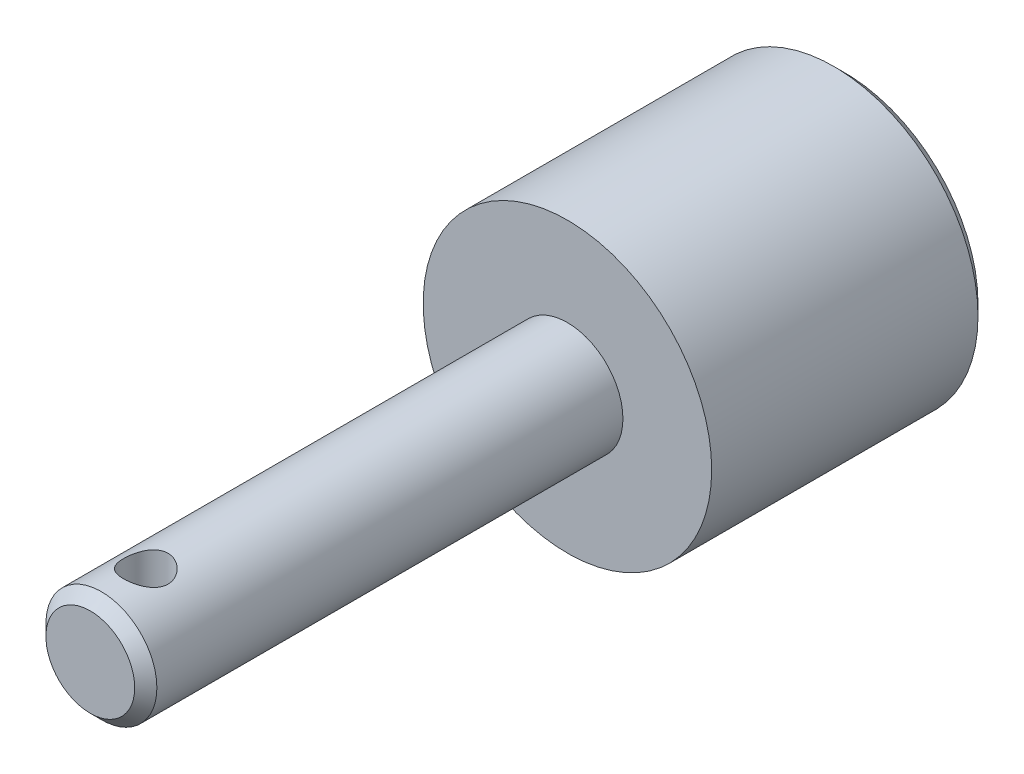
ISO-10303-21;
HEADER;
FILE_DESCRIPTION(('STEP AP214'),'2;1');
FILE_NAME('part.step','',(''),(''),'','','');
FILE_SCHEMA(('AUTOMOTIVE_DESIGN { 1 0 10303 214 1 1 1 1 }'));
ENDSEC;
DATA;
#1=APPLICATION_CONTEXT('core data for automotive mechanical design processes');
#2=APPLICATION_PROTOCOL_DEFINITION('international standard','automotive_design',2000,#1);
#3=PRODUCT_CONTEXT('',#1,'mechanical');
#4=PRODUCT('Part','Part','',(#3));
#5=PRODUCT_RELATED_PRODUCT_CATEGORY('part','',(#4));
#6=PRODUCT_DEFINITION_FORMATION('','',#4);
#7=PRODUCT_DEFINITION_CONTEXT('part definition',#1,'design');
#8=PRODUCT_DEFINITION('design','',#6,#7);
#9=PRODUCT_DEFINITION_SHAPE('','',#8);
#10=(LENGTH_UNIT() NAMED_UNIT(*) SI_UNIT(.MILLI.,.METRE.));
#11=(NAMED_UNIT(*) PLANE_ANGLE_UNIT() SI_UNIT($,.RADIAN.));
#12=(NAMED_UNIT(*) SI_UNIT($,.STERADIAN.) SOLID_ANGLE_UNIT());
#13=UNCERTAINTY_MEASURE_WITH_UNIT(LENGTH_MEASURE(1.E-05),#10,'distance_accuracy_value','');
#14=(GEOMETRIC_REPRESENTATION_CONTEXT(3) GLOBAL_UNCERTAINTY_ASSIGNED_CONTEXT((#13)) GLOBAL_UNIT_ASSIGNED_CONTEXT((#10,
#11,#12)) REPRESENTATION_CONTEXT('',''));
#15=CARTESIAN_POINT('',(0.,0.,0.));
#16=DIRECTION('',(0.,0.,1.));
#17=DIRECTION('',(1.,0.,0.));
#18=AXIS2_PLACEMENT_3D('',#15,#16,#17);
#19=CARTESIAN_POINT('',(0.,0.,50.));
#20=DIRECTION('',(0.,0.,1.));
#21=DIRECTION('',(1.,0.,0.));
#22=AXIS2_PLACEMENT_3D('',#19,#20,#21);
#23=PLANE('',#22);
#24=CARTESIAN_POINT('',(0.,0.,50.));
#25=DIRECTION('',(0.,0.,1.));
#26=DIRECTION('',(1.,0.,0.));
#27=AXIS2_PLACEMENT_3D('',#24,#25,#26);
#28=CIRCLE('',#27,26.);
#29=CARTESIAN_POINT('',(26.,0.,50.));
#30=VERTEX_POINT('',#29);
#31=EDGE_CURVE('E158',#30,#30,#28,.T.);
#32=ORIENTED_EDGE('',*,*,#31,.T.);
#33=EDGE_LOOP('',(#32));
#34=FACE_BOUND('',#33,.T.);
#35=CARTESIAN_POINT('',(0.,0.,50.));
#36=DIRECTION('',(0.,0.,1.));
#37=DIRECTION('',(1.,0.,0.));
#38=AXIS2_PLACEMENT_3D('',#35,#36,#37);
#39=CIRCLE('',#38,10.);
#40=CARTESIAN_POINT('',(10.,0.,50.));
#41=VERTEX_POINT('',#40);
#42=EDGE_CURVE('E73',#41,#41,#39,.T.);
#43=ORIENTED_EDGE('',*,*,#42,.F.);
#44=EDGE_LOOP('',(#43));
#45=FACE_BOUND('',#44,.T.);
#46=ADVANCED_FACE('F41',(#34,#45),#23,.T.);
#47=CARTESIAN_POINT('',(0.,0.,50.));
#48=DIRECTION('',(0.,0.,-1.));
#49=DIRECTION('',(-1.,0.,0.));
#50=AXIS2_PLACEMENT_3D('',#47,#48,#49);
#51=CYLINDRICAL_SURFACE('',#50,26.);
#52=CARTESIAN_POINT('',(0.,0.,1.99999999999998));
#53=DIRECTION('',(0.,0.,1.));
#54=DIRECTION('',(1.,0.,0.));
#55=AXIS2_PLACEMENT_3D('',#52,#53,#54);
#56=CIRCLE('',#55,26.);
#57=CARTESIAN_POINT('',(26.,0.,1.99999999999998));
#58=VERTEX_POINT('',#57);
#59=EDGE_CURVE('E49',#58,#58,#56,.T.);
#60=ORIENTED_EDGE('',*,*,#59,.T.);
#61=EDGE_LOOP('',(#60));
#62=FACE_BOUND('',#61,.T.);
#63=ORIENTED_EDGE('',*,*,#31,.F.);
#64=EDGE_LOOP('',(#63));
#65=FACE_BOUND('',#64,.T.);
#66=ADVANCED_FACE('F100',(#62,#65),#51,.T.);
#67=CARTESIAN_POINT('',(0.,0.,0.));
#68=DIRECTION('',(0.,0.,1.));
#69=DIRECTION('',(1.,0.,0.));
#70=AXIS2_PLACEMENT_3D('',#67,#68,#69);
#71=PLANE('',#70);
#72=CARTESIAN_POINT('',(0.,0.,0.));
#73=DIRECTION('',(0.,0.,1.));
#74=DIRECTION('',(1.,0.,0.));
#75=AXIS2_PLACEMENT_3D('',#72,#73,#74);
#76=CIRCLE('',#75,24.);
#77=CARTESIAN_POINT('',(24.,0.,0.));
#78=VERTEX_POINT('',#77);
#79=EDGE_CURVE('E10',#78,#78,#76,.F.);
#80=ORIENTED_EDGE('',*,*,#79,.T.);
#81=EDGE_LOOP('',(#80));
#82=FACE_BOUND('',#81,.T.);
#83=ADVANCED_FACE('F96',(#82),#71,.F.);
#84=CARTESIAN_POINT('',(0.,0.,136.));
#85=DIRECTION('',(0.,0.,-1.));
#86=DIRECTION('',(-1.,0.,0.));
#87=AXIS2_PLACEMENT_3D('',#84,#85,#86);
#88=CYLINDRICAL_SURFACE('',#87,10.);
#89=CARTESIAN_POINT('',(0.,-10.,130.));
#90=CARTESIAN_POINT('',(0.107549581345537,-9.99999886871264,129.999998425067));
#91=CARTESIAN_POINT('',(0.215132147940362,-9.99825999367799,129.99565632892));
#92=CARTESIAN_POINT('',(0.429535200549549,-9.99134740691108,129.978326617216));
#93=CARTESIAN_POINT('',(0.536355162703302,-9.98617152790588,129.965333546597));
#94=CARTESIAN_POINT('',(0.748635856497418,-9.97250573560117,129.930791965449));
#95=CARTESIAN_POINT('',(0.854093134440872,-9.96400865312144,129.90922494538));
#96=CARTESIAN_POINT('',(1.0626676111401,-9.94393017211574,129.857758269563));
#97=CARTESIAN_POINT('',(1.1657838422726,-9.932347522545,129.827855233745));
#98=CARTESIAN_POINT('',(1.46979509681069,-9.89349112162205,129.726277191284));
#99=CARTESIAN_POINT('',(1.66629107461992,-9.86204458846134,129.642578180994));
#100=CARTESIAN_POINT('',(2.04217417878101,-9.79113035538708,129.44595378265));
#101=CARTESIAN_POINT('',(2.22156721456798,-9.75166544086262,129.333038539885));
#102=CARTESIAN_POINT('',(2.56699339938209,-9.66661825353092,129.075531245478));
#103=CARTESIAN_POINT('',(2.73212223266508,-9.62084608086599,128.929787289424));
#104=CARTESIAN_POINT('',(3.03635232313263,-9.52921139577231,128.613199390848));
#105=CARTESIAN_POINT('',(3.17544084661153,-9.48334885017047,128.442343240983));
#106=CARTESIAN_POINT('',(3.42974847409895,-9.39445587657958,128.071144031434));
#107=CARTESIAN_POINT('',(3.54362978572888,-9.35164233015934,127.869827073936));
#108=CARTESIAN_POINT('',(3.73550961465235,-9.2766729328807,127.448927157199));
#109=CARTESIAN_POINT('',(3.81352517485724,-9.24451202207145,127.229352932259));
#110=CARTESIAN_POINT('',(3.92779760260542,-9.19652715590089,126.788575344314));
#111=CARTESIAN_POINT('',(3.96578791979826,-9.18002840771385,126.567897531912));
#112=CARTESIAN_POINT('',(4.00434593508728,-9.16328008038142,126.122730000323));
#113=CARTESIAN_POINT('',(4.00493203570087,-9.16302251073202,125.898242209989));
#114=CARTESIAN_POINT('',(3.9699787321474,-9.17821000534301,125.468486657777));
#115=CARTESIAN_POINT('',(3.93695062778272,-9.19256349925666,125.262968571234));
#116=CARTESIAN_POINT('',(3.83989376129508,-9.23352375055553,124.86068088765));
#117=CARTESIAN_POINT('',(3.77585958980135,-9.26013264599921,124.663912823694));
#118=CARTESIAN_POINT('',(3.6173894649114,-9.32318970221162,124.279964327708));
#119=CARTESIAN_POINT('',(3.52235972457939,-9.35982758573424,124.093061521918));
#120=CARTESIAN_POINT('',(3.30501292151569,-9.43876232767927,123.73716836725));
#121=CARTESIAN_POINT('',(3.1826856102159,-9.48106130910412,123.568184781187));
#122=CARTESIAN_POINT('',(2.90310119889356,-9.57053473488081,123.239180542404));
#123=CARTESIAN_POINT('',(2.74387492593717,-9.61783329953252,123.08086254111));
#124=CARTESIAN_POINT('',(2.40062885486449,-9.70919649915614,122.792631043994));
#125=CARTESIAN_POINT('',(2.21660413066998,-9.75326048890393,122.662723205179));
#126=CARTESIAN_POINT('',(1.82415530521056,-9.83429362529358,122.432765105169));
#127=CARTESIAN_POINT('',(1.61532098269266,-9.87110540190899,122.333355437606));
#128=CARTESIAN_POINT('',(1.18204753096606,-9.93229656657448,122.171664277844));
#129=CARTESIAN_POINT('',(0.9576163936994,-9.95668226924746,122.109363924885));
#130=CARTESIAN_POINT('',(0.513791775215594,-9.98912279013839,122.027103409161));
#131=CARTESIAN_POINT('',(0.294886587971144,-9.99805891667034,122.004855091493));
#132=CARTESIAN_POINT('',(-0.143690619615701,-10.0013695702126,121.996573798943));
#133=CARTESIAN_POINT('',(-0.363362426448176,-9.99574787164577,122.010531436905));
#134=CARTESIAN_POINT('',(-0.786865478243648,-9.97115134127512,122.072583505104));
#135=CARTESIAN_POINT('',(-0.990964983549756,-9.95278782691064,122.119115960703));
#136=CARTESIAN_POINT('',(-1.38827085612274,-9.90518882810983,122.242871416619));
#137=CARTESIAN_POINT('',(-1.58147582045412,-9.87595194712999,122.320098359335));
#138=CARTESIAN_POINT('',(-1.95815757162884,-9.80833189541687,122.505569879362));
#139=CARTESIAN_POINT('',(-2.14115604549353,-9.76969631959847,122.614690944095));
#140=CARTESIAN_POINT('',(-2.48688718251039,-9.68746729490809,122.859880647803));
#141=CARTESIAN_POINT('',(-2.64961168158684,-9.64387186219643,122.995960085814));
#142=CARTESIAN_POINT('',(-2.96144608598878,-9.55290235277181,123.301740025933));
#143=CARTESIAN_POINT('',(-3.10894786734725,-9.50546882853787,123.473067083141));
#144=CARTESIAN_POINT('',(-3.37350239509234,-9.4148334583058,123.83888016589));
#145=CARTESIAN_POINT('',(-3.4905501236659,-9.37163231039242,124.033370000199));
#146=CARTESIAN_POINT('',(-3.69161500286277,-9.2942859982933,124.442923389673));
#147=CARTESIAN_POINT('',(-3.77530118531766,-9.2602326182174,124.658168000244));
#148=CARTESIAN_POINT('',(-3.90459244315909,-9.20647346903736,125.101467301613));
#149=CARTESIAN_POINT('',(-3.95022562452798,-9.1867571119746,125.329512404842));
#150=CARTESIAN_POINT('',(-3.99943122157417,-9.16543518780389,125.774255809844));
#151=CARTESIAN_POINT('',(-4.0057941177721,-9.16262842667612,125.990589701895));
#152=CARTESIAN_POINT('',(-3.98360636538274,-9.17229671415009,126.421089692721));
#153=CARTESIAN_POINT('',(-3.9550601501471,-9.18476982225497,126.635256063282));
#154=CARTESIAN_POINT('',(-3.8661425648813,-9.2225330048627,127.04666446089));
#155=CARTESIAN_POINT('',(-3.80707437387707,-9.2472967218297,127.244240846221));
#156=CARTESIAN_POINT('',(-3.66001151041638,-9.30647993934965,127.62675696179));
#157=CARTESIAN_POINT('',(-3.57200884934551,-9.34090210615104,127.811693185111));
#158=CARTESIAN_POINT('',(-3.36374310804135,-9.4179725282647,128.175220410709));
#159=CARTESIAN_POINT('',(-3.24192140926545,-9.46097893410836,128.352841830688));
#160=CARTESIAN_POINT('',(-2.97179350239179,-9.54927479921251,128.685982142625));
#161=CARTESIAN_POINT('',(-2.82347931168583,-9.59456494363941,128.84149434729));
#162=CARTESIAN_POINT('',(-2.49297412446701,-9.68587647140964,129.136423592531));
#163=CARTESIAN_POINT('',(-2.30921017071956,-9.73175488236392,129.274143383982));
#164=CARTESIAN_POINT('',(-2.01716584575535,-9.7949502762577,129.456048108938));
#165=CARTESIAN_POINT('',(-1.91699501972427,-9.81509269692655,129.512607063853));
#166=CARTESIAN_POINT('',(-1.71180110982482,-9.85294835133019,129.617037995405));
#167=CARTESIAN_POINT('',(-1.60678027559744,-9.87066269647665,129.664913949808));
#168=CARTESIAN_POINT('',(-1.3945464690433,-9.9028559935491,129.750747984685));
#169=CARTESIAN_POINT('',(-1.28740777135873,-9.91738778532477,129.788870154747));
#170=CARTESIAN_POINT('',(-1.06995577523384,-9.94319722915714,129.855921347721));
#171=CARTESIAN_POINT('',(-0.959643983352626,-9.95447639837582,129.88485465735));
#172=CARTESIAN_POINT('',(-0.73694521585684,-9.97343330649399,129.933174836149));
#173=CARTESIAN_POINT('',(-0.624564263591282,-9.98112017494336,129.952585911645));
#174=CARTESIAN_POINT('',(-0.398419132407604,-9.99270031578293,129.981738570666));
#175=CARTESIAN_POINT('',(-0.284655994966355,-9.99659628445551,129.991487026834));
#176=CARTESIAN_POINT('',(-0.113830463425494,-9.99951445883957,129.998785895573));
#177=CARTESIAN_POINT('',(-0.0569198512645311,-10.0000005987258,130.000000833522));
#178=CARTESIAN_POINT('',(0.,-10.,130.));
#179=B_SPLINE_CURVE_WITH_KNOTS('',3,(#89,#90,#91,#92,#93,#94,#95,#96,#97,#98,#99,#100,#101,#102,
#103,#104,#105,#106,#107,#108,#109,#110,#111,#112,#113,#114,#115,#116,#117,#118,#119,#120,#121,
#122,#123,#124,#125,#126,#127,#128,#129,#130,#131,#132,#133,#134,#135,#136,#137,#138,#139,#140,
#141,#142,#143,#144,#145,#146,#147,#148,#149,#150,#151,#152,#153,#154,#155,#156,#157,#158,#159,
#160,#161,#162,#163,#164,#165,#166,#167,#168,#169,#170,#171,#172,#173,#174,#175,#176,#177,#178),
.UNSPECIFIED.,.T.,.F.,(4,2,2,2,2,2,2,2,2,2,2,2,2,2,2,2,2,2,2,2,2,2,2,2,2,2,2,2,2,2,2,2,2,2,2,2,
2,2,2,2,2,2,2,2,4),(0.,0.322603993422156,0.645411604786482,0.968919914471238,1.29255959093094,
1.93701523385824,2.58124739027476,3.25313995292303,3.92536021760331,4.62749749529945,
5.32930078128046,5.99927442509166,6.66891844572486,7.29195888698824,7.9151080641227,
8.55097484497809,9.18708075776543,9.87235930273289,10.5577741757964,11.2567305822579,
11.9553314412776,12.6125760095619,13.2696501904034,13.8972014302891,14.5248332988777,
15.171662586967,15.8187515089811,16.50856181149,17.1984856998767,17.8950932218183,
18.5911857719204,19.2371857868567,19.8831037702626,20.5034786899771,21.124025035105,
21.7801016801356,22.4363763459696,23.1352007896785,23.4851924266232,23.8350233218042,
24.1785111324565,24.52183846562,24.8642884495951,25.2064946871486,25.3772305569977),.UNSPECIFIED.);
#180=CARTESIAN_POINT('',(0.,-10.,130.));
#181=VERTEX_POINT('',#180);
#182=EDGE_CURVE('E64',#181,#181,#179,.T.);
#183=ORIENTED_EDGE('',*,*,#182,.T.);
#184=EDGE_LOOP('',(#183));
#185=FACE_BOUND('',#184,.T.);
#186=CARTESIAN_POINT('',(0.,10.,130.));
#187=CARTESIAN_POINT('',(-0.107549581345537,9.99999886871264,129.999998425067));
#188=CARTESIAN_POINT('',(-0.215132147940362,9.99825999367799,129.99565632892));
#189=CARTESIAN_POINT('',(-0.429535200549549,9.99134740691108,129.978326617216));
#190=CARTESIAN_POINT('',(-0.536355162703302,9.98617152790588,129.965333546597));
#191=CARTESIAN_POINT('',(-0.748635856497418,9.97250573560117,129.930791965449));
#192=CARTESIAN_POINT('',(-0.854093134440872,9.96400865312144,129.90922494538));
#193=CARTESIAN_POINT('',(-1.0626676111401,9.94393017211574,129.857758269563));
#194=CARTESIAN_POINT('',(-1.1657838422726,9.932347522545,129.827855233745));
#195=CARTESIAN_POINT('',(-1.46979509681069,9.89349112162205,129.726277191284));
#196=CARTESIAN_POINT('',(-1.66629107461992,9.86204458846134,129.642578180994));
#197=CARTESIAN_POINT('',(-2.04217417878101,9.79113035538708,129.44595378265));
#198=CARTESIAN_POINT('',(-2.22156721456798,9.75166544086262,129.333038539885));
#199=CARTESIAN_POINT('',(-2.56699339938209,9.66661825353092,129.075531245478));
#200=CARTESIAN_POINT('',(-2.73212223266508,9.62084608086599,128.929787289424));
#201=CARTESIAN_POINT('',(-3.03635232313263,9.52921139577231,128.613199390848));
#202=CARTESIAN_POINT('',(-3.17544084661153,9.48334885017047,128.442343240983));
#203=CARTESIAN_POINT('',(-3.42974847409895,9.39445587657958,128.071144031434));
#204=CARTESIAN_POINT('',(-3.54362978572888,9.35164233015934,127.869827073936));
#205=CARTESIAN_POINT('',(-3.73550961465235,9.2766729328807,127.448927157199));
#206=CARTESIAN_POINT('',(-3.81352517485724,9.24451202207145,127.229352932259));
#207=CARTESIAN_POINT('',(-3.92779760260542,9.19652715590089,126.788575344314));
#208=CARTESIAN_POINT('',(-3.96578791979826,9.18002840771385,126.567897531912));
#209=CARTESIAN_POINT('',(-4.00434593508728,9.16328008038142,126.122730000323));
#210=CARTESIAN_POINT('',(-4.00493203570087,9.16302251073202,125.898242209989));
#211=CARTESIAN_POINT('',(-3.9699787321474,9.17821000534301,125.468486657777));
#212=CARTESIAN_POINT('',(-3.93695062778272,9.19256349925666,125.262968571234));
#213=CARTESIAN_POINT('',(-3.83989376129508,9.23352375055553,124.86068088765));
#214=CARTESIAN_POINT('',(-3.77585958980135,9.26013264599921,124.663912823694));
#215=CARTESIAN_POINT('',(-3.6173894649114,9.32318970221162,124.279964327708));
#216=CARTESIAN_POINT('',(-3.52235972457939,9.35982758573424,124.093061521918));
#217=CARTESIAN_POINT('',(-3.30501292151569,9.43876232767927,123.73716836725));
#218=CARTESIAN_POINT('',(-3.1826856102159,9.48106130910412,123.568184781187));
#219=CARTESIAN_POINT('',(-2.90310119889356,9.57053473488081,123.239180542404));
#220=CARTESIAN_POINT('',(-2.74387492593717,9.61783329953252,123.08086254111));
#221=CARTESIAN_POINT('',(-2.40062885486449,9.70919649915614,122.792631043994));
#222=CARTESIAN_POINT('',(-2.21660413066998,9.75326048890393,122.662723205179));
#223=CARTESIAN_POINT('',(-1.82415530521056,9.83429362529358,122.432765105169));
#224=CARTESIAN_POINT('',(-1.61532098269266,9.87110540190899,122.333355437606));
#225=CARTESIAN_POINT('',(-1.18204753096606,9.93229656657448,122.171664277844));
#226=CARTESIAN_POINT('',(-0.9576163936994,9.95668226924746,122.109363924885));
#227=CARTESIAN_POINT('',(-0.513791775215594,9.98912279013839,122.027103409161));
#228=CARTESIAN_POINT('',(-0.294886587971144,9.99805891667034,122.004855091493));
#229=CARTESIAN_POINT('',(0.143690619615701,10.0013695702126,121.996573798943));
#230=CARTESIAN_POINT('',(0.363362426448176,9.99574787164577,122.010531436905));
#231=CARTESIAN_POINT('',(0.786865478243648,9.97115134127512,122.072583505104));
#232=CARTESIAN_POINT('',(0.990964983549756,9.95278782691064,122.119115960703));
#233=CARTESIAN_POINT('',(1.38827085612274,9.90518882810983,122.242871416619));
#234=CARTESIAN_POINT('',(1.58147582045412,9.87595194712999,122.320098359335));
#235=CARTESIAN_POINT('',(1.95815757162884,9.80833189541687,122.505569879362));
#236=CARTESIAN_POINT('',(2.14115604549353,9.76969631959847,122.614690944095));
#237=CARTESIAN_POINT('',(2.48688718251039,9.68746729490809,122.859880647803));
#238=CARTESIAN_POINT('',(2.64961168158684,9.64387186219643,122.995960085814));
#239=CARTESIAN_POINT('',(2.96144608598878,9.55290235277181,123.301740025933));
#240=CARTESIAN_POINT('',(3.10894786734725,9.50546882853787,123.473067083141));
#241=CARTESIAN_POINT('',(3.37350239509234,9.4148334583058,123.83888016589));
#242=CARTESIAN_POINT('',(3.4905501236659,9.37163231039242,124.033370000199));
#243=CARTESIAN_POINT('',(3.69161500286277,9.2942859982933,124.442923389673));
#244=CARTESIAN_POINT('',(3.77530118531766,9.2602326182174,124.658168000244));
#245=CARTESIAN_POINT('',(3.90459244315909,9.20647346903736,125.101467301613));
#246=CARTESIAN_POINT('',(3.95022562452798,9.1867571119746,125.329512404842));
#247=CARTESIAN_POINT('',(3.99943122157417,9.16543518780389,125.774255809844));
#248=CARTESIAN_POINT('',(4.0057941177721,9.16262842667612,125.990589701895));
#249=CARTESIAN_POINT('',(3.98360636538274,9.17229671415009,126.421089692721));
#250=CARTESIAN_POINT('',(3.9550601501471,9.18476982225497,126.635256063282));
#251=CARTESIAN_POINT('',(3.8661425648813,9.2225330048627,127.04666446089));
#252=CARTESIAN_POINT('',(3.80707437387707,9.2472967218297,127.244240846221));
#253=CARTESIAN_POINT('',(3.66001151041638,9.30647993934965,127.62675696179));
#254=CARTESIAN_POINT('',(3.57200884934551,9.34090210615104,127.811693185111));
#255=CARTESIAN_POINT('',(3.36374310804135,9.4179725282647,128.175220410709));
#256=CARTESIAN_POINT('',(3.24192140926545,9.46097893410836,128.352841830688));
#257=CARTESIAN_POINT('',(2.97179350239179,9.54927479921251,128.685982142625));
#258=CARTESIAN_POINT('',(2.82347931168583,9.59456494363941,128.84149434729));
#259=CARTESIAN_POINT('',(2.49297412446701,9.68587647140964,129.136423592531));
#260=CARTESIAN_POINT('',(2.30921017071956,9.73175488236392,129.274143383982));
#261=CARTESIAN_POINT('',(2.01716584575535,9.7949502762577,129.456048108938));
#262=CARTESIAN_POINT('',(1.91699501972427,9.81509269692655,129.512607063853));
#263=CARTESIAN_POINT('',(1.71180110982482,9.85294835133019,129.617037995405));
#264=CARTESIAN_POINT('',(1.60678027559744,9.87066269647665,129.664913949808));
#265=CARTESIAN_POINT('',(1.3945464690433,9.9028559935491,129.750747984685));
#266=CARTESIAN_POINT('',(1.28740777135873,9.91738778532477,129.788870154747));
#267=CARTESIAN_POINT('',(1.06995577523384,9.94319722915714,129.855921347721));
#268=CARTESIAN_POINT('',(0.959643983352626,9.95447639837582,129.88485465735));
#269=CARTESIAN_POINT('',(0.73694521585684,9.97343330649399,129.933174836149));
#270=CARTESIAN_POINT('',(0.624564263591282,9.98112017494336,129.952585911645));
#271=CARTESIAN_POINT('',(0.398419132407604,9.99270031578293,129.981738570666));
#272=CARTESIAN_POINT('',(0.284655994966355,9.99659628445551,129.991487026834));
#273=CARTESIAN_POINT('',(0.113830463425494,9.99951445883957,129.998785895573));
#274=CARTESIAN_POINT('',(0.0569198512645311,10.0000005987258,130.000000833522));
#275=CARTESIAN_POINT('',(0.,10.,130.));
#276=B_SPLINE_CURVE_WITH_KNOTS('',3,(#186,#187,#188,#189,#190,#191,#192,#193,#194,#195,#196,
#197,#198,#199,#200,#201,#202,#203,#204,#205,#206,#207,#208,#209,#210,#211,#212,#213,#214,#215,
#216,#217,#218,#219,#220,#221,#222,#223,#224,#225,#226,#227,#228,#229,#230,#231,#232,#233,#234,
#235,#236,#237,#238,#239,#240,#241,#242,#243,#244,#245,#246,#247,#248,#249,#250,#251,#252,#253,
#254,#255,#256,#257,#258,#259,#260,#261,#262,#263,#264,#265,#266,#267,#268,#269,#270,#271,#272,
#273,#274,#275),.UNSPECIFIED.,.T.,.F.,(4,2,2,2,2,2,2,2,2,2,2,2,2,2,2,2,2,2,2,2,2,2,2,2,2,2,2,2,
2,2,2,2,2,2,2,2,2,2,2,2,2,2,2,2,4),(0.,0.322603993422156,0.645411604786482,0.968919914471238,
1.29255959093094,1.93701523385824,2.58124739027476,3.25313995292303,3.92536021760331,
4.62749749529945,5.32930078128046,5.99927442509166,6.66891844572486,7.29195888698824,
7.9151080641227,8.55097484497809,9.18708075776543,9.87235930273289,10.5577741757964,
11.2567305822579,11.9553314412776,12.6125760095619,13.2696501904034,13.8972014302891,
14.5248332988777,15.171662586967,15.8187515089811,16.50856181149,17.1984856998767,
17.8950932218183,18.5911857719204,19.2371857868567,19.8831037702626,20.5034786899771,
21.124025035105,21.7801016801356,22.4363763459696,23.1352007896785,23.4851924266232,
23.8350233218042,24.1785111324565,24.52183846562,24.8642884495951,25.2064946871486,
25.3772305569977),.UNSPECIFIED.);
#277=CARTESIAN_POINT('',(0.,10.,130.));
#278=VERTEX_POINT('',#277);
#279=EDGE_CURVE('E74',#278,#278,#276,.T.);
#280=ORIENTED_EDGE('',*,*,#279,.T.);
#281=EDGE_LOOP('',(#280));
#282=FACE_BOUND('',#281,.T.);
#283=CARTESIAN_POINT('',(0.,0.,134.));
#284=DIRECTION('',(0.,0.,1.));
#285=DIRECTION('',(1.,0.,0.));
#286=AXIS2_PLACEMENT_3D('',#283,#284,#285);
#287=CIRCLE('',#286,10.);
#288=CARTESIAN_POINT('',(10.,0.,134.));
#289=VERTEX_POINT('',#288);
#290=EDGE_CURVE('E55',#289,#289,#287,.F.);
#291=ORIENTED_EDGE('',*,*,#290,.T.);
#292=EDGE_LOOP('',(#291));
#293=FACE_BOUND('',#292,.T.);
#294=ORIENTED_EDGE('',*,*,#42,.T.);
#295=EDGE_LOOP('',(#294));
#296=FACE_BOUND('',#295,.T.);
#297=ADVANCED_FACE('F78',(#185,#282,#293,#296),#88,.T.);
#298=CARTESIAN_POINT('',(0.,0.,136.));
#299=DIRECTION('',(0.,0.,1.));
#300=DIRECTION('',(1.,0.,0.));
#301=AXIS2_PLACEMENT_3D('',#298,#299,#300);
#302=PLANE('',#301);
#303=CARTESIAN_POINT('',(0.,0.,136.));
#304=DIRECTION('',(0.,0.,1.));
#305=DIRECTION('',(1.,0.,0.));
#306=AXIS2_PLACEMENT_3D('',#303,#304,#305);
#307=CIRCLE('',#306,7.99999999999997);
#308=CARTESIAN_POINT('',(7.99999999999997,0.,136.));
#309=VERTEX_POINT('',#308);
#310=EDGE_CURVE('E61',#309,#309,#307,.T.);
#311=ORIENTED_EDGE('',*,*,#310,.T.);
#312=EDGE_LOOP('',(#311));
#313=FACE_BOUND('',#312,.T.);
#314=ADVANCED_FACE('F87',(#313),#302,.T.);
#315=CARTESIAN_POINT('',(0.,0.,136.));
#316=DIRECTION('',(0.,0.,-1.));
#317=DIRECTION('',(-1.,0.,0.));
#318=AXIS2_PLACEMENT_3D('',#315,#316,#317);
#319=CONICAL_SURFACE('',#318,7.99999999999997,0.78539816339745);
#320=ORIENTED_EDGE('',*,*,#290,.F.);
#321=EDGE_LOOP('',(#320));
#322=FACE_BOUND('',#321,.T.);
#323=ORIENTED_EDGE('',*,*,#310,.F.);
#324=EDGE_LOOP('',(#323));
#325=FACE_BOUND('',#324,.T.);
#326=ADVANCED_FACE('F85',(#322,#325),#319,.T.);
#327=CARTESIAN_POINT('',(0.,-26.,126.));
#328=DIRECTION('',(0.,1.,0.));
#329=DIRECTION('',(0.,0.,1.));
#330=AXIS2_PLACEMENT_3D('',#327,#328,#329);
#331=CYLINDRICAL_SURFACE('',#330,4.);
#332=ORIENTED_EDGE('',*,*,#279,.F.);
#333=EDGE_LOOP('',(#332));
#334=FACE_BOUND('',#333,.T.);
#335=ORIENTED_EDGE('',*,*,#182,.F.);
#336=EDGE_LOOP('',(#335));
#337=FACE_BOUND('',#336,.T.);
#338=ADVANCED_FACE('F82',(#334,#337),#331,.F.);
#339=CARTESIAN_POINT('',(0.,0.,1.99999999999998));
#340=DIRECTION('',(0.,0.,1.));
#341=DIRECTION('',(1.,0.,0.));
#342=AXIS2_PLACEMENT_3D('',#339,#340,#341);
#343=CONICAL_SURFACE('',#342,26.,0.785398163397449);
#344=ORIENTED_EDGE('',*,*,#79,.F.);
#345=EDGE_LOOP('',(#344));
#346=FACE_BOUND('',#345,.T.);
#347=ORIENTED_EDGE('',*,*,#59,.F.);
#348=EDGE_LOOP('',(#347));
#349=FACE_BOUND('',#348,.T.);
#350=ADVANCED_FACE('F43',(#346,#349),#343,.T.);
#351=CLOSED_SHELL('',(#46,#66,#83,#297,#314,#326,#338,#350));
#352=MANIFOLD_SOLID_BREP('B2',#351);
#353=ADVANCED_BREP_SHAPE_REPRESENTATION('',(#18,#352),#14);
#354=SHAPE_DEFINITION_REPRESENTATION(#9,#353);
ENDSEC;
END-ISO-10303-21;
